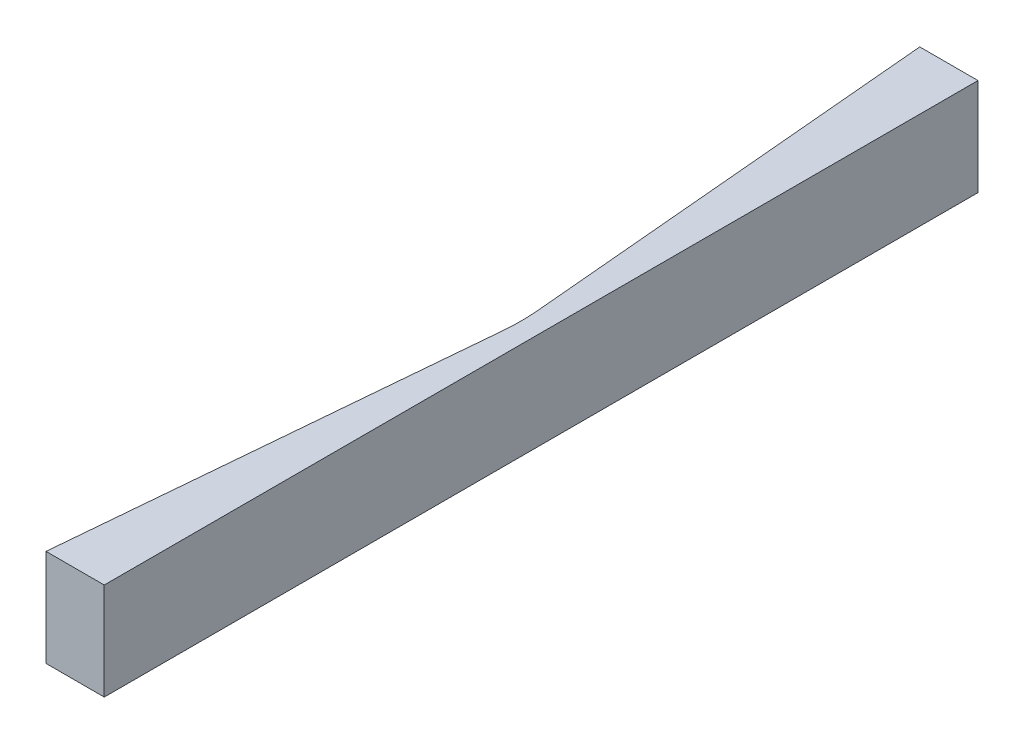
ISO-10303-21;
HEADER;
FILE_DESCRIPTION(('STEP AP214'),'2;1');
FILE_NAME('part.step','',(''),(''),'','','');
FILE_SCHEMA(('AUTOMOTIVE_DESIGN { 1 0 10303 214 1 1 1 1 }'));
ENDSEC;
DATA;
#1=APPLICATION_CONTEXT('core data for automotive mechanical design processes');
#2=APPLICATION_PROTOCOL_DEFINITION('international standard','automotive_design',2000,#1);
#3=PRODUCT_CONTEXT('',#1,'mechanical');
#4=PRODUCT('Part','Part','',(#3));
#5=PRODUCT_RELATED_PRODUCT_CATEGORY('part','',(#4));
#6=PRODUCT_DEFINITION_FORMATION('','',#4);
#7=PRODUCT_DEFINITION_CONTEXT('part definition',#1,'design');
#8=PRODUCT_DEFINITION('design','',#6,#7);
#9=PRODUCT_DEFINITION_SHAPE('','',#8);
#10=(LENGTH_UNIT() NAMED_UNIT(*) SI_UNIT(.MILLI.,.METRE.));
#11=(NAMED_UNIT(*) PLANE_ANGLE_UNIT() SI_UNIT($,.RADIAN.));
#12=(NAMED_UNIT(*) SI_UNIT($,.STERADIAN.) SOLID_ANGLE_UNIT());
#13=UNCERTAINTY_MEASURE_WITH_UNIT(LENGTH_MEASURE(1.E-05),#10,'distance_accuracy_value','');
#14=(GEOMETRIC_REPRESENTATION_CONTEXT(3) GLOBAL_UNCERTAINTY_ASSIGNED_CONTEXT((#13)) GLOBAL_UNIT_ASSIGNED_CONTEXT((#10,
#11,#12)) REPRESENTATION_CONTEXT('',''));
#15=CARTESIAN_POINT('',(0.,0.,0.));
#16=DIRECTION('',(0.,0.,1.));
#17=DIRECTION('',(1.,0.,0.));
#18=AXIS2_PLACEMENT_3D('',#15,#16,#17);
#19=CARTESIAN_POINT('',(0.,5.,-45.));
#20=DIRECTION('',(-1.,0.,0.));
#21=DIRECTION('',(0.,0.,1.));
#22=AXIS2_PLACEMENT_3D('',#19,#20,#21);
#23=PLANE('',#22);
#24=DIRECTION('',(0.,0.,-1.));
#25=VECTOR('',#24,1.);
#26=CARTESIAN_POINT('',(0.,0.,-45.));
#27=LINE('',#26,#25);
#28=CARTESIAN_POINT('',(0.,0.,0.));
#29=VERTEX_POINT('',#28);
#30=CARTESIAN_POINT('',(0.,0.,-45.));
#31=VERTEX_POINT('',#30);
#32=EDGE_CURVE('E112',#29,#31,#27,.T.);
#33=ORIENTED_EDGE('',*,*,#32,.T.);
#34=DIRECTION('',(0.,-1.,0.));
#35=VECTOR('',#34,1.);
#36=CARTESIAN_POINT('',(0.,5.,-45.));
#37=LINE('',#36,#35);
#38=CARTESIAN_POINT('',(0.,5.,-45.));
#39=VERTEX_POINT('',#38);
#40=EDGE_CURVE('E94',#39,#31,#37,.T.);
#41=ORIENTED_EDGE('',*,*,#40,.F.);
#42=DIRECTION('',(0.,0.,-1.));
#43=VECTOR('',#42,1.);
#44=CARTESIAN_POINT('',(0.,5.,-45.));
#45=LINE('',#44,#43);
#46=CARTESIAN_POINT('',(0.,5.,0.));
#47=VERTEX_POINT('',#46);
#48=EDGE_CURVE('E100',#47,#39,#45,.T.);
#49=ORIENTED_EDGE('',*,*,#48,.F.);
#50=DIRECTION('',(0.,-1.,0.));
#51=VECTOR('',#50,1.);
#52=CARTESIAN_POINT('',(0.,5.,0.));
#53=LINE('',#52,#51);
#54=EDGE_CURVE('E123',#47,#29,#53,.T.);
#55=ORIENTED_EDGE('',*,*,#54,.T.);
#56=EDGE_LOOP('',(#33,#41,#49,#55));
#57=FACE_BOUND('',#56,.T.);
#58=ADVANCED_FACE('F37',(#57),#23,.F.);
#59=CARTESIAN_POINT('',(-3.,5.,-45.));
#60=DIRECTION('',(0.,0.,1.));
#61=DIRECTION('',(1.,0.,0.));
#62=AXIS2_PLACEMENT_3D('',#59,#60,#61);
#63=PLANE('',#62);
#64=DIRECTION('',(-1.,0.,0.));
#65=VECTOR('',#64,1.);
#66=CARTESIAN_POINT('',(-3.,0.,-45.));
#67=LINE('',#66,#65);
#68=CARTESIAN_POINT('',(-3.,0.,-45.));
#69=VERTEX_POINT('',#68);
#70=EDGE_CURVE('E130',#31,#69,#67,.T.);
#71=ORIENTED_EDGE('',*,*,#70,.T.);
#72=DIRECTION('',(0.,-1.,0.));
#73=VECTOR('',#72,1.);
#74=CARTESIAN_POINT('',(-3.,5.,-45.));
#75=LINE('',#74,#73);
#76=CARTESIAN_POINT('',(-3.,5.,-45.));
#77=VERTEX_POINT('',#76);
#78=EDGE_CURVE('E97',#77,#69,#75,.T.);
#79=ORIENTED_EDGE('',*,*,#78,.F.);
#80=DIRECTION('',(-1.,0.,0.));
#81=VECTOR('',#80,1.);
#82=CARTESIAN_POINT('',(-3.,5.,-45.));
#83=LINE('',#82,#81);
#84=EDGE_CURVE('E90',#39,#77,#83,.T.);
#85=ORIENTED_EDGE('',*,*,#84,.F.);
#86=ORIENTED_EDGE('',*,*,#40,.T.);
#87=EDGE_LOOP('',(#71,#79,#85,#86));
#88=FACE_BOUND('',#87,.T.);
#89=ADVANCED_FACE('F92',(#88),#63,.F.);
#90=CARTESIAN_POINT('',(-0.999999999999997,5.,-22.5));
#91=DIRECTION('',(0.996072640692687,0.,-0.0885397902837945));
#92=DIRECTION('',(-0.0885397902837945,0.,-0.996072640692687));
#93=AXIS2_PLACEMENT_3D('',#90,#91,#92);
#94=PLANE('',#93);
#95=DIRECTION('',(0.0885397902837945,0.,0.996072640692687));
#96=VECTOR('',#95,1.);
#97=CARTESIAN_POINT('',(-0.999999999999997,0.,-22.5));
#98=LINE('',#97,#96);
#99=CARTESIAN_POINT('',(-1.07870203580782,0.,-23.3853979028379));
#100=VERTEX_POINT('',#99);
#101=EDGE_CURVE('E128',#69,#100,#98,.T.);
#102=ORIENTED_EDGE('',*,*,#101,.T.);
#103=DIRECTION('',(0.,-1.,0.));
#104=VECTOR('',#103,1.);
#105=CARTESIAN_POINT('',(-1.07870203580782,5.,-23.3853979028379));
#106=LINE('',#105,#104);
#107=CARTESIAN_POINT('',(-1.07870203580782,5.,-23.3853979028379));
#108=VERTEX_POINT('',#107);
#109=EDGE_CURVE('E52',#100,#108,#106,.F.);
#110=ORIENTED_EDGE('',*,*,#109,.T.);
#111=DIRECTION('',(0.0885397902837945,0.,0.996072640692687));
#112=VECTOR('',#111,1.);
#113=CARTESIAN_POINT('',(-0.999999999999997,5.,-22.5));
#114=LINE('',#113,#112);
#115=EDGE_CURVE('E99',#77,#108,#114,.T.);
#116=ORIENTED_EDGE('',*,*,#115,.F.);
#117=ORIENTED_EDGE('',*,*,#78,.T.);
#118=EDGE_LOOP('',(#102,#110,#116,#117));
#119=FACE_BOUND('',#118,.T.);
#120=ADVANCED_FACE('F154',(#119),#94,.F.);
#121=CARTESIAN_POINT('',(-3.,5.,0.));
#122=DIRECTION('',(0.996072640692687,0.,0.0885397902837945));
#123=DIRECTION('',(0.0885397902837945,0.,-0.996072640692687));
#124=AXIS2_PLACEMENT_3D('',#121,#122,#123);
#125=PLANE('',#124);
#126=DIRECTION('',(-0.0885397902837945,0.,0.996072640692687));
#127=VECTOR('',#126,1.);
#128=CARTESIAN_POINT('',(-3.,5.,0.));
#129=LINE('',#128,#127);
#130=CARTESIAN_POINT('',(-1.07870203580781,5.,-21.6146020971621));
#131=VERTEX_POINT('',#130);
#132=CARTESIAN_POINT('',(-3.,5.,0.));
#133=VERTEX_POINT('',#132);
#134=EDGE_CURVE('E134',#131,#133,#129,.T.);
#135=ORIENTED_EDGE('',*,*,#134,.F.);
#136=DIRECTION('',(0.,-1.,0.));
#137=VECTOR('',#136,1.);
#138=CARTESIAN_POINT('',(-1.07870203580781,0.,-21.6146020971621));
#139=LINE('',#138,#137);
#140=CARTESIAN_POINT('',(-1.07870203580781,0.,-21.6146020971621));
#141=VERTEX_POINT('',#140);
#142=EDGE_CURVE('E113',#131,#141,#139,.T.);
#143=ORIENTED_EDGE('',*,*,#142,.T.);
#144=DIRECTION('',(-0.0885397902837945,0.,0.996072640692687));
#145=VECTOR('',#144,1.);
#146=CARTESIAN_POINT('',(-3.,0.,0.));
#147=LINE('',#146,#145);
#148=CARTESIAN_POINT('',(-3.,0.,0.));
#149=VERTEX_POINT('',#148);
#150=EDGE_CURVE('E126',#141,#149,#147,.T.);
#151=ORIENTED_EDGE('',*,*,#150,.T.);
#152=DIRECTION('',(0.,-1.,0.));
#153=VECTOR('',#152,1.);
#154=CARTESIAN_POINT('',(-3.,5.,0.));
#155=LINE('',#154,#153);
#156=EDGE_CURVE('E117',#133,#149,#155,.T.);
#157=ORIENTED_EDGE('',*,*,#156,.F.);
#158=EDGE_LOOP('',(#135,#143,#151,#157));
#159=FACE_BOUND('',#158,.T.);
#160=ADVANCED_FACE('F141',(#159),#125,.F.);
#161=CARTESIAN_POINT('',(0.,5.,0.));
#162=DIRECTION('',(0.,0.,-1.));
#163=DIRECTION('',(-1.,0.,0.));
#164=AXIS2_PLACEMENT_3D('',#161,#162,#163);
#165=PLANE('',#164);
#166=DIRECTION('',(1.,0.,0.));
#167=VECTOR('',#166,1.);
#168=CARTESIAN_POINT('',(0.,0.,0.));
#169=LINE('',#168,#167);
#170=EDGE_CURVE('E109',#149,#29,#169,.T.);
#171=ORIENTED_EDGE('',*,*,#170,.T.);
#172=ORIENTED_EDGE('',*,*,#54,.F.);
#173=DIRECTION('',(1.,0.,0.));
#174=VECTOR('',#173,1.);
#175=CARTESIAN_POINT('',(0.,5.,0.));
#176=LINE('',#175,#174);
#177=EDGE_CURVE('E105',#133,#47,#176,.T.);
#178=ORIENTED_EDGE('',*,*,#177,.F.);
#179=ORIENTED_EDGE('',*,*,#156,.T.);
#180=EDGE_LOOP('',(#171,#172,#178,#179));
#181=FACE_BOUND('',#180,.T.);
#182=ADVANCED_FACE('F146',(#181),#165,.F.);
#183=CARTESIAN_POINT('',(0.,5.,0.));
#184=DIRECTION('',(0.,-1.,0.));
#185=DIRECTION('',(0.,0.,-1.));
#186=AXIS2_PLACEMENT_3D('',#183,#184,#185);
#187=PLANE('',#186);
#188=ORIENTED_EDGE('',*,*,#48,.T.);
#189=ORIENTED_EDGE('',*,*,#84,.T.);
#190=ORIENTED_EDGE('',*,*,#115,.T.);
#191=CARTESIAN_POINT('',(-11.0394284427347,5.,-22.5));
#192=DIRECTION('',(0.,-1.,0.));
#193=DIRECTION('',(0.,0.,-1.));
#194=AXIS2_PLACEMENT_3D('',#191,#192,#193);
#195=CIRCLE('',#194,10.);
#196=EDGE_CURVE('E11',#108,#131,#195,.T.);
#197=ORIENTED_EDGE('',*,*,#196,.T.);
#198=ORIENTED_EDGE('',*,*,#134,.T.);
#199=ORIENTED_EDGE('',*,*,#177,.T.);
#200=EDGE_LOOP('',(#188,#189,#190,#197,#198,#199));
#201=FACE_BOUND('',#200,.T.);
#202=ADVANCED_FACE('F103',(#201),#187,.F.);
#203=CARTESIAN_POINT('',(0.,0.,0.));
#204=DIRECTION('',(0.,-1.,0.));
#205=DIRECTION('',(0.,0.,-1.));
#206=AXIS2_PLACEMENT_3D('',#203,#204,#205);
#207=PLANE('',#206);
#208=ORIENTED_EDGE('',*,*,#32,.F.);
#209=ORIENTED_EDGE('',*,*,#170,.F.);
#210=ORIENTED_EDGE('',*,*,#150,.F.);
#211=CARTESIAN_POINT('',(-11.0394284427347,0.,-22.5));
#212=DIRECTION('',(0.,-1.,0.));
#213=DIRECTION('',(0.,0.,-1.));
#214=AXIS2_PLACEMENT_3D('',#211,#212,#213);
#215=CIRCLE('',#214,10.);
#216=EDGE_CURVE('E45',#141,#100,#215,.F.);
#217=ORIENTED_EDGE('',*,*,#216,.T.);
#218=ORIENTED_EDGE('',*,*,#101,.F.);
#219=ORIENTED_EDGE('',*,*,#70,.F.);
#220=EDGE_LOOP('',(#208,#209,#210,#217,#218,#219));
#221=FACE_BOUND('',#220,.T.);
#222=ADVANCED_FACE('F144',(#221),#207,.T.);
#223=CARTESIAN_POINT('',(-11.0394284427347,5.,-22.5));
#224=DIRECTION('',(0.,1.,0.));
#225=DIRECTION('',(0.,0.,1.));
#226=AXIS2_PLACEMENT_3D('',#223,#224,#225);
#227=CYLINDRICAL_SURFACE('',#226,10.);
#228=ORIENTED_EDGE('',*,*,#196,.F.);
#229=ORIENTED_EDGE('',*,*,#109,.F.);
#230=ORIENTED_EDGE('',*,*,#216,.F.);
#231=ORIENTED_EDGE('',*,*,#142,.F.);
#232=EDGE_LOOP('',(#228,#229,#230,#231));
#233=FACE_BOUND('',#232,.T.);
#234=ADVANCED_FACE('F39',(#233),#227,.F.);
#235=CLOSED_SHELL('',(#58,#89,#120,#160,#182,#202,#222,#234));
#236=MANIFOLD_SOLID_BREP('B2',#235);
#237=ADVANCED_BREP_SHAPE_REPRESENTATION('',(#18,#236),#14);
#238=SHAPE_DEFINITION_REPRESENTATION(#9,#237);
ENDSEC;
END-ISO-10303-21;
